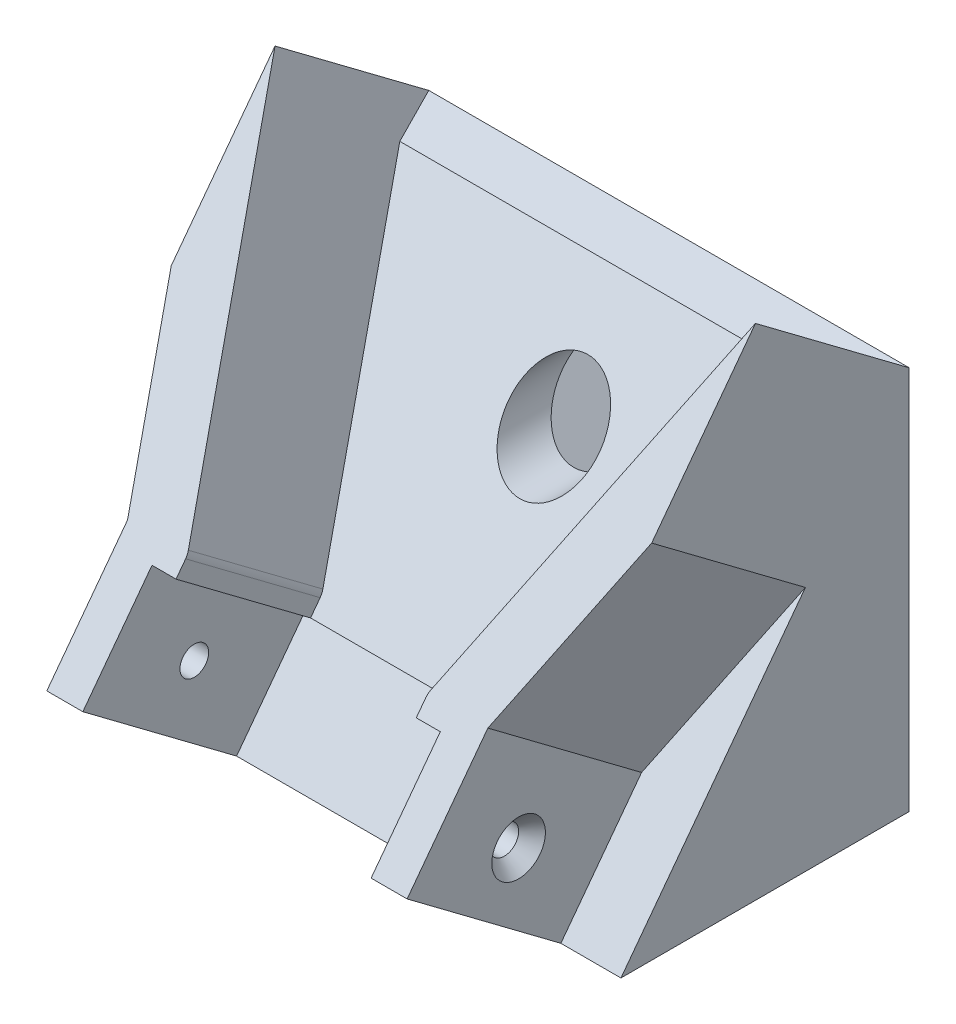
ISO-10303-21;
HEADER;
FILE_DESCRIPTION(('STEP AP214'),'2;1');
FILE_NAME('part.step','',(''),(''),'','','');
FILE_SCHEMA(('AUTOMOTIVE_DESIGN { 1 0 10303 214 1 1 1 1 }'));
ENDSEC;
DATA;
#1=APPLICATION_CONTEXT('core data for automotive mechanical design processes');
#2=APPLICATION_PROTOCOL_DEFINITION('international standard','automotive_design',2000,#1);
#3=PRODUCT_CONTEXT('',#1,'mechanical');
#4=PRODUCT('Part','Part','',(#3));
#5=PRODUCT_RELATED_PRODUCT_CATEGORY('part','',(#4));
#6=PRODUCT_DEFINITION_FORMATION('','',#4);
#7=PRODUCT_DEFINITION_CONTEXT('part definition',#1,'design');
#8=PRODUCT_DEFINITION('design','',#6,#7);
#9=PRODUCT_DEFINITION_SHAPE('','',#8);
#10=(LENGTH_UNIT() NAMED_UNIT(*) SI_UNIT(.MILLI.,.METRE.));
#11=(NAMED_UNIT(*) PLANE_ANGLE_UNIT() SI_UNIT($,.RADIAN.));
#12=(NAMED_UNIT(*) SI_UNIT($,.STERADIAN.) SOLID_ANGLE_UNIT());
#13=UNCERTAINTY_MEASURE_WITH_UNIT(LENGTH_MEASURE(1.E-05),#10,'distance_accuracy_value','');
#14=(GEOMETRIC_REPRESENTATION_CONTEXT(3) GLOBAL_UNCERTAINTY_ASSIGNED_CONTEXT((#13)) GLOBAL_UNIT_ASSIGNED_CONTEXT((#10,
#11,#12)) REPRESENTATION_CONTEXT('',''));
#15=CARTESIAN_POINT('',(0.,0.,0.));
#16=DIRECTION('',(0.,0.,1.));
#17=DIRECTION('',(1.,0.,0.));
#18=AXIS2_PLACEMENT_3D('',#15,#16,#17);
#19=CARTESIAN_POINT('',(63.5,50.8,0.));
#20=DIRECTION('',(0.,-0.600001429132666,-0.799998928148506));
#21=DIRECTION('',(0.,0.799998928148506,-0.600001429132666));
#22=AXIS2_PLACEMENT_3D('',#19,#20,#21);
#23=PLANE('',#22);
#24=DIRECTION('',(0.,-0.799998928148506,0.600001429132666));
#25=VECTOR('',#24,1.);
#26=CARTESIAN_POINT('',(50.8,0.,38.1001417970417));
#27=LINE('',#26,#25);
#28=CARTESIAN_POINT('',(50.8,12.1919836649832,28.9561200170599));
#29=VERTEX_POINT('',#28);
#30=CARTESIAN_POINT('',(50.8,0.,38.1001417970417));
#31=VERTEX_POINT('',#30);
#32=EDGE_CURVE('E404',#29,#31,#27,.T.);
#33=ORIENTED_EDGE('',*,*,#32,.F.);
#34=DIRECTION('',(1.,0.,0.));
#35=VECTOR('',#34,1.);
#36=CARTESIAN_POINT('',(15.875,12.1919836649832,28.9561200170599));
#37=LINE('',#36,#35);
#38=CARTESIAN_POINT('',(12.7,12.1919836649832,28.9561200170599));
#39=VERTEX_POINT('',#38);
#40=EDGE_CURVE('E360',#39,#29,#37,.T.);
#41=ORIENTED_EDGE('',*,*,#40,.F.);
#42=DIRECTION('',(0.,0.799998928148506,-0.600001429132666));
#43=VECTOR('',#42,1.);
#44=CARTESIAN_POINT('',(12.7,0.,38.1001417970417));
#45=LINE('',#44,#43);
#46=CARTESIAN_POINT('',(12.7,0.,38.1001417970417));
#47=VERTEX_POINT('',#46);
#48=EDGE_CURVE('E362',#47,#39,#45,.T.);
#49=ORIENTED_EDGE('',*,*,#48,.F.);
#50=DIRECTION('',(-1.,0.,0.));
#51=VECTOR('',#50,1.);
#52=CARTESIAN_POINT('',(63.5,0.,38.1001417970417));
#53=LINE('',#52,#51);
#54=EDGE_CURVE('E309',#31,#47,#53,.T.);
#55=ORIENTED_EDGE('',*,*,#54,.F.);
#56=EDGE_LOOP('',(#33,#41,#49,#55));
#57=FACE_BOUND('',#56,.T.);
#58=ADVANCED_FACE('F46',(#57),#23,.F.);
#59=CARTESIAN_POINT('',(15.875,29.4640172424502,47.752089162035));
#60=DIRECTION('',(-1.,0.,0.));
#61=DIRECTION('',(0.,0.,1.));
#62=AXIS2_PLACEMENT_3D('',#59,#60,#61);
#63=PLANE('',#62);
#64=DIRECTION('',(0.,-0.799998928148505,0.600001429132667));
#65=VECTOR('',#64,1.);
#66=CARTESIAN_POINT('',(15.875,15.7862453588135,30.2291690314906));
#67=LINE('',#66,#65);
#68=CARTESIAN_POINT('',(15.875,15.7862453588135,30.2291690314906));
#69=VERTEX_POINT('',#68);
#70=CARTESIAN_POINT('',(15.875,14.0969882024794,31.4961166139314));
#71=VERTEX_POINT('',#70);
#72=EDGE_CURVE('E268',#69,#71,#67,.T.);
#73=ORIENTED_EDGE('',*,*,#72,.F.);
#74=DIRECTION('',(0.,-0.600001429132666,-0.799998928148506));
#75=VECTOR('',#74,1.);
#76=CARTESIAN_POINT('',(15.875,29.121277121287,48.0091452095911));
#77=LINE('',#76,#75);
#78=CARTESIAN_POINT('',(15.875,29.121277121287,48.0091452095911));
#79=VERTEX_POINT('',#78);
#80=EDGE_CURVE('E304',#69,#79,#77,.F.);
#81=ORIENTED_EDGE('',*,*,#80,.T.);
#82=DIRECTION('',(0.,0.799998928148506,-0.600001429132666));
#83=VECTOR('',#82,1.);
#84=CARTESIAN_POINT('',(15.875,29.4640172424502,47.752089162035));
#85=LINE('',#84,#83);
#86=CARTESIAN_POINT('',(15.875,27.4320199649529,49.2760927920319));
#87=VERTEX_POINT('',#86);
#88=EDGE_CURVE('E375',#87,#79,#85,.T.);
#89=ORIENTED_EDGE('',*,*,#88,.F.);
#90=DIRECTION('',(0.,-0.600001429132666,-0.799998928148506));
#91=VECTOR('',#90,1.);
#92=CARTESIAN_POINT('',(15.875,27.4320199649529,49.2760927920319));
#93=LINE('',#92,#91);
#94=EDGE_CURVE('E248',#87,#71,#93,.T.);
#95=ORIENTED_EDGE('',*,*,#94,.T.);
#96=EDGE_LOOP('',(#73,#81,#89,#95));
#97=FACE_BOUND('',#96,.T.);
#98=ADVANCED_FACE('F473',(#97),#63,.F.);
#99=CARTESIAN_POINT('',(47.625,27.4320199649529,49.2760927920319));
#100=DIRECTION('',(1.,0.,0.));
#101=DIRECTION('',(0.,0.,-1.));
#102=AXIS2_PLACEMENT_3D('',#99,#100,#101);
#103=PLANE('',#102);
#104=DIRECTION('',(0.,-0.799998928148506,0.600001429132666));
#105=VECTOR('',#104,1.);
#106=CARTESIAN_POINT('',(47.625,15.7862453588135,30.2291690314905));
#107=LINE('',#106,#105);
#108=CARTESIAN_POINT('',(47.625,15.7862453588135,30.2291690314905));
#109=VERTEX_POINT('',#108);
#110=CARTESIAN_POINT('',(47.625,14.0969882024794,31.4961166139314));
#111=VERTEX_POINT('',#110);
#112=EDGE_CURVE('E63',#109,#111,#107,.T.);
#113=ORIENTED_EDGE('',*,*,#112,.T.);
#114=DIRECTION('',(0.,-0.600001429132666,-0.799998928148506));
#115=VECTOR('',#114,1.);
#116=CARTESIAN_POINT('',(47.625,27.4320199649529,49.2760927920319));
#117=LINE('',#116,#115);
#118=CARTESIAN_POINT('',(47.625,27.4320199649529,49.2760927920319));
#119=VERTEX_POINT('',#118);
#120=EDGE_CURVE('E295',#119,#111,#117,.T.);
#121=ORIENTED_EDGE('',*,*,#120,.F.);
#122=DIRECTION('',(0.,-0.799998928148505,0.600001429132667));
#123=VECTOR('',#122,1.);
#124=CARTESIAN_POINT('',(47.625,27.4320199649529,49.2760927920319));
#125=LINE('',#124,#123);
#126=CARTESIAN_POINT('',(47.625,29.121277121287,48.0091452095911));
#127=VERTEX_POINT('',#126);
#128=EDGE_CURVE('E392',#127,#119,#125,.T.);
#129=ORIENTED_EDGE('',*,*,#128,.F.);
#130=DIRECTION('',(0.,-0.600001429132666,-0.799998928148506));
#131=VECTOR('',#130,1.);
#132=CARTESIAN_POINT('',(47.625,29.121277121287,48.0091452095911));
#133=LINE('',#132,#131);
#134=EDGE_CURVE('E299',#127,#109,#133,.T.);
#135=ORIENTED_EDGE('',*,*,#134,.T.);
#136=EDGE_LOOP('',(#113,#121,#129,#135));
#137=FACE_BOUND('',#136,.T.);
#138=ADVANCED_FACE('F481',(#137),#103,.F.);
#139=CARTESIAN_POINT('',(13.335,29.121277121287,48.0091452095911));
#140=DIRECTION('',(0.,-0.600001429132666,-0.799998928148506));
#141=DIRECTION('',(0.,0.799998928148506,-0.600001429132666));
#142=AXIS2_PLACEMENT_3D('',#139,#140,#141);
#143=CYLINDRICAL_SURFACE('',#142,2.54);
#144=ORIENTED_EDGE('',*,*,#80,.F.);
#145=CARTESIAN_POINT('',(13.335,15.7862453588135,30.2291690314906));
#146=DIRECTION('',(0.,-0.600001429132666,-0.799998928148506));
#147=DIRECTION('',(0.,0.799998928148506,-0.600001429132666));
#148=AXIS2_PLACEMENT_3D('',#145,#146,#147);
#149=CIRCLE('',#148,2.54000000000002);
#150=CARTESIAN_POINT('',(15.7344715875595,16.4527631109403,29.7292788569575));
#151=VERTEX_POINT('',#150);
#152=EDGE_CURVE('E265',#151,#69,#149,.T.);
#153=ORIENTED_EDGE('',*,*,#152,.F.);
#154=DIRECTION('',(0.,-0.600001429132666,-0.799998928148506));
#155=VECTOR('',#154,1.);
#156=CARTESIAN_POINT('',(15.7344715875595,29.7877948734138,47.5092550350581));
#157=LINE('',#156,#155);
#158=CARTESIAN_POINT('',(15.7344715875595,29.7877948734138,47.5092550350581));
#159=VERTEX_POINT('',#158);
#160=EDGE_CURVE('E219',#159,#151,#157,.T.);
#161=ORIENTED_EDGE('',*,*,#160,.F.);
#162=CARTESIAN_POINT('',(13.335,29.121277121287,48.0091452095911));
#163=DIRECTION('',(0.,0.600001429132666,0.799998928148506));
#164=DIRECTION('',(0.,-0.799998928148506,0.600001429132666));
#165=AXIS2_PLACEMENT_3D('',#162,#163,#164);
#166=CIRCLE('',#165,2.54);
#167=EDGE_CURVE('E302',#79,#159,#166,.T.);
#168=ORIENTED_EDGE('',*,*,#167,.F.);
#169=EDGE_LOOP('',(#144,#153,#161,#168));
#170=FACE_BOUND('',#169,.T.);
#171=ADVANCED_FACE('F767',(#170),#143,.T.);
#172=CARTESIAN_POINT('',(50.165,29.121277121287,48.0091452095911));
#173=DIRECTION('',(0.,-0.600001429132666,-0.799998928148506));
#174=DIRECTION('',(0.,0.799998928148506,-0.600001429132666));
#175=AXIS2_PLACEMENT_3D('',#172,#173,#174);
#176=CYLINDRICAL_SURFACE('',#175,2.54);
#177=DIRECTION('',(0.,-0.600001429132666,-0.799998928148506));
#178=VECTOR('',#177,1.);
#179=CARTESIAN_POINT('',(47.7655284124406,29.7877948734138,47.509255035058));
#180=LINE('',#179,#178);
#181=CARTESIAN_POINT('',(47.7655284124406,16.4527631109403,29.7292788569575));
#182=VERTEX_POINT('',#181);
#183=CARTESIAN_POINT('',(47.7655284124406,29.7877948734138,47.509255035058));
#184=VERTEX_POINT('',#183);
#185=EDGE_CURVE('E55',#182,#184,#180,.F.);
#186=ORIENTED_EDGE('',*,*,#185,.F.);
#187=CARTESIAN_POINT('',(50.1649999999999,15.7862453588135,30.2291690314905));
#188=DIRECTION('',(0.,0.600001429132666,0.799998928148506));
#189=DIRECTION('',(0.,-0.799998928148506,0.600001429132666));
#190=AXIS2_PLACEMENT_3D('',#187,#188,#189);
#191=CIRCLE('',#190,2.5399999999999);
#192=EDGE_CURVE('E282',#182,#109,#191,.T.);
#193=ORIENTED_EDGE('',*,*,#192,.T.);
#194=ORIENTED_EDGE('',*,*,#134,.F.);
#195=CARTESIAN_POINT('',(50.165,29.121277121287,48.0091452095911));
#196=DIRECTION('',(0.,-0.600001429132666,-0.799998928148506));
#197=DIRECTION('',(0.,0.799998928148506,-0.600001429132666));
#198=AXIS2_PLACEMENT_3D('',#195,#196,#197);
#199=CIRCLE('',#198,2.54);
#200=EDGE_CURVE('E12',#184,#127,#199,.F.);
#201=ORIENTED_EDGE('',*,*,#200,.F.);
#202=EDGE_LOOP('',(#186,#193,#194,#201));
#203=FACE_BOUND('',#202,.T.);
#204=ADVANCED_FACE('F48',(#203),#176,.T.);
#205=CARTESIAN_POINT('',(55.5625,29.4640172424502,47.752089162035));
#206=DIRECTION('',(-1.,0.,0.));
#207=DIRECTION('',(0.,-1.,0.));
#208=AXIS2_PLACEMENT_3D('',#205,#206,#207);
#209=PLANE('',#208);
#210=DIRECTION('',(0.,0.799998928148506,-0.600001429132666));
#211=VECTOR('',#210,1.);
#212=CARTESIAN_POINT('',(55.5625,14.2239809424804,27.4321163870629));
#213=LINE('',#212,#211);
#214=CARTESIAN_POINT('',(55.5625,0.,38.1001417970417));
#215=VERTEX_POINT('',#214);
#216=CARTESIAN_POINT('',(55.5625,14.2239809424804,27.4321163870629));
#217=VERTEX_POINT('',#216);
#218=EDGE_CURVE('E387',#215,#217,#213,.T.);
#219=ORIENTED_EDGE('',*,*,#218,.T.);
#220=DIRECTION('',(0.,-0.600001429132666,-0.799998928148506));
#221=VECTOR('',#220,1.);
#222=CARTESIAN_POINT('',(55.5625,29.4640172424502,47.752089162035));
#223=LINE('',#222,#221);
#224=CARTESIAN_POINT('',(55.5625,29.4640172424502,47.752089162035));
#225=VERTEX_POINT('',#224);
#226=EDGE_CURVE('E402',#225,#217,#223,.T.);
#227=ORIENTED_EDGE('',*,*,#226,.F.);
#228=DIRECTION('',(0.,0.799998928148506,-0.600001429132666));
#229=VECTOR('',#228,1.);
#230=CARTESIAN_POINT('',(55.5625,29.4640172424502,47.752089162035));
#231=LINE('',#230,#229);
#232=CARTESIAN_POINT('',(55.5625,15.2400362999697,58.4201145720138));
#233=VERTEX_POINT('',#232);
#234=EDGE_CURVE('E400',#233,#225,#231,.T.);
#235=ORIENTED_EDGE('',*,*,#234,.F.);
#236=DIRECTION('',(0.,-0.600001429132666,-0.799998928148506));
#237=VECTOR('',#236,1.);
#238=CARTESIAN_POINT('',(55.5625,15.2400362999697,58.4201145720138));
#239=LINE('',#238,#237);
#240=EDGE_CURVE('E411',#233,#215,#239,.T.);
#241=ORIENTED_EDGE('',*,*,#240,.T.);
#242=EDGE_LOOP('',(#219,#227,#235,#241));
#243=FACE_BOUND('',#242,.T.);
#244=CARTESIAN_POINT('',(55.5625,13.7160099824765,43.6881172945368));
#245=DIRECTION('',(1.,0.,0.));
#246=DIRECTION('',(0.,0.,-1.));
#247=AXIS2_PLACEMENT_3D('',#244,#245,#246);
#248=CIRCLE('',#247,3.5433);
#249=CARTESIAN_POINT('',(55.5625,13.7160099824765,40.1448172945368));
#250=VERTEX_POINT('',#249);
#251=EDGE_CURVE('E439',#250,#250,#248,.T.);
#252=ORIENTED_EDGE('',*,*,#251,.F.);
#253=EDGE_LOOP('',(#252));
#254=FACE_BOUND('',#253,.T.);
#255=ADVANCED_FACE('F672',(#243,#254),#209,.F.);
#256=CARTESIAN_POINT('',(7.9375,29.4640172424502,47.752089162035));
#257=DIRECTION('',(1.,0.,0.));
#258=DIRECTION('',(0.,1.,0.));
#259=AXIS2_PLACEMENT_3D('',#256,#257,#258);
#260=PLANE('',#259);
#261=DIRECTION('',(0.,-0.799998928148506,0.600001429132666));
#262=VECTOR('',#261,1.);
#263=CARTESIAN_POINT('',(7.9375,14.2239809424804,27.4321163870629));
#264=LINE('',#263,#262);
#265=CARTESIAN_POINT('',(7.9375,14.2239809424804,27.4321163870629));
#266=VERTEX_POINT('',#265);
#267=CARTESIAN_POINT('',(7.93750000000001,0.,38.1001417970417));
#268=VERTEX_POINT('',#267);
#269=EDGE_CURVE('E353',#266,#268,#264,.T.);
#270=ORIENTED_EDGE('',*,*,#269,.T.);
#271=DIRECTION('',(0.,-0.600001429132666,-0.799998928148506));
#272=VECTOR('',#271,1.);
#273=CARTESIAN_POINT('',(7.93750000000001,15.2400362999697,58.4201145720138));
#274=LINE('',#273,#272);
#275=CARTESIAN_POINT('',(7.93750000000001,15.2400362999697,58.4201145720138));
#276=VERTEX_POINT('',#275);
#277=EDGE_CURVE('E349',#276,#268,#274,.T.);
#278=ORIENTED_EDGE('',*,*,#277,.F.);
#279=DIRECTION('',(0.,-0.799998928148506,0.600001429132666));
#280=VECTOR('',#279,1.);
#281=CARTESIAN_POINT('',(7.9375,29.4640172424502,47.752089162035));
#282=LINE('',#281,#280);
#283=CARTESIAN_POINT('',(7.9375,29.4640172424502,47.752089162035));
#284=VERTEX_POINT('',#283);
#285=EDGE_CURVE('E352',#284,#276,#282,.T.);
#286=ORIENTED_EDGE('',*,*,#285,.F.);
#287=DIRECTION('',(0.,-0.600001429132666,-0.799998928148506));
#288=VECTOR('',#287,1.);
#289=CARTESIAN_POINT('',(7.9375,29.4640172424502,47.752089162035));
#290=LINE('',#289,#288);
#291=EDGE_CURVE('E255',#284,#266,#290,.T.);
#292=ORIENTED_EDGE('',*,*,#291,.T.);
#293=EDGE_LOOP('',(#270,#278,#286,#292));
#294=FACE_BOUND('',#293,.T.);
#295=CARTESIAN_POINT('',(7.9375,13.7160099824765,43.6881172945368));
#296=DIRECTION('',(-1.,0.,0.));
#297=DIRECTION('',(0.,0.,1.));
#298=AXIS2_PLACEMENT_3D('',#295,#296,#297);
#299=CIRCLE('',#298,3.5433);
#300=CARTESIAN_POINT('',(7.9375,13.7160099824765,47.2314172945368));
#301=VERTEX_POINT('',#300);
#302=EDGE_CURVE('E430',#301,#301,#299,.T.);
#303=ORIENTED_EDGE('',*,*,#302,.F.);
#304=EDGE_LOOP('',(#303));
#305=FACE_BOUND('',#304,.T.);
#306=ADVANCED_FACE('F488',(#294,#305),#260,.F.);
#307=DIRECTION('',(0.328011144260879,0.75573807014581,-0.566805662086182));
#308=VECTOR('',#307,1.);
#309=CARTESIAN_POINT('',(63.5,32.5119904712402,13.7160581935314));
#310=LINE('',#309,#308);
#311=CARTESIAN_POINT('',(63.5,32.5119904712403,13.7160581935314));
#312=VERTEX_POINT('',#311);
#313=EDGE_CURVE('E368',#217,#312,#310,.T.);
#314=ORIENTED_EDGE('',*,*,#313,.F.);
#315=ORIENTED_EDGE('',*,*,#218,.F.);
#316=CARTESIAN_POINT('',(63.5,0.,38.1001417970417));
#317=VERTEX_POINT('',#316);
#318=EDGE_CURVE('E220',#317,#215,#53,.T.);
#319=ORIENTED_EDGE('',*,*,#318,.F.);
#320=DIRECTION('',(0.,-0.799998928148506,0.600001429132666));
#321=VECTOR('',#320,1.);
#322=CARTESIAN_POINT('',(63.5,50.8,0.));
#323=LINE('',#322,#321);
#324=EDGE_CURVE('E290',#312,#317,#323,.T.);
#325=ORIENTED_EDGE('',*,*,#324,.F.);
#326=EDGE_LOOP('',(#314,#315,#319,#325));
#327=FACE_BOUND('',#326,.T.);
#328=ADVANCED_FACE('F476',(#327),#23,.F.);
#329=ORIENTED_EDGE('',*,*,#269,.F.);
#330=DIRECTION('',(0.32801114426088,-0.75573807014581,0.566805662086182));
#331=VECTOR('',#330,1.);
#332=CARTESIAN_POINT('',(0.,32.5119904712402,13.7160581935315));
#333=LINE('',#332,#331);
#334=CARTESIAN_POINT('',(0.,32.5119904712402,13.7160581935315));
#335=VERTEX_POINT('',#334);
#336=EDGE_CURVE('E357',#335,#266,#333,.T.);
#337=ORIENTED_EDGE('',*,*,#336,.F.);
#338=DIRECTION('',(0.,-0.799998928148506,0.600001429132666));
#339=VECTOR('',#338,1.);
#340=CARTESIAN_POINT('',(0.,50.8,0.));
#341=LINE('',#340,#339);
#342=CARTESIAN_POINT('',(0.,0.,38.1001417970417));
#343=VERTEX_POINT('',#342);
#344=EDGE_CURVE('E242',#335,#343,#341,.T.);
#345=ORIENTED_EDGE('',*,*,#344,.T.);
#346=EDGE_CURVE('E310',#268,#343,#53,.T.);
#347=ORIENTED_EDGE('',*,*,#346,.F.);
#348=EDGE_LOOP('',(#329,#337,#345,#347));
#349=FACE_BOUND('',#348,.T.);
#350=ADVANCED_FACE('F477',(#349),#23,.F.);
#351=CARTESIAN_POINT('',(63.5,0.,38.1001417970417));
#352=DIRECTION('',(0.,1.,0.));
#353=DIRECTION('',(0.,0.,1.));
#354=AXIS2_PLACEMENT_3D('',#351,#352,#353);
#355=PLANE('',#354);
#356=DIRECTION('',(0.,0.,-1.));
#357=VECTOR('',#356,1.);
#358=CARTESIAN_POINT('',(0.,0.,38.1001417970417));
#359=LINE('',#358,#357);
#360=CARTESIAN_POINT('',(0.,0.,0.));
#361=VERTEX_POINT('',#360);
#362=EDGE_CURVE('E291',#343,#361,#359,.T.);
#363=ORIENTED_EDGE('',*,*,#362,.T.);
#364=DIRECTION('',(-1.,0.,0.));
#365=VECTOR('',#364,1.);
#366=CARTESIAN_POINT('',(63.5,0.,0.));
#367=LINE('',#366,#365);
#368=CARTESIAN_POINT('',(63.5,0.,0.));
#369=VERTEX_POINT('',#368);
#370=EDGE_CURVE('E239',#369,#361,#367,.T.);
#371=ORIENTED_EDGE('',*,*,#370,.F.);
#372=DIRECTION('',(0.,0.,-1.));
#373=VECTOR('',#372,1.);
#374=CARTESIAN_POINT('',(63.5,0.,38.1001417970417));
#375=LINE('',#374,#373);
#376=EDGE_CURVE('E312',#317,#369,#375,.T.);
#377=ORIENTED_EDGE('',*,*,#376,.F.);
#378=ORIENTED_EDGE('',*,*,#318,.T.);
#379=DIRECTION('',(1.,0.,0.));
#380=VECTOR('',#379,1.);
#381=CARTESIAN_POINT('',(55.5625,0.,38.1001417970417));
#382=LINE('',#381,#380);
#383=EDGE_CURVE('E406',#31,#215,#382,.T.);
#384=ORIENTED_EDGE('',*,*,#383,.F.);
#385=ORIENTED_EDGE('',*,*,#54,.T.);
#386=DIRECTION('',(1.,0.,0.));
#387=VECTOR('',#386,1.);
#388=CARTESIAN_POINT('',(7.93750000000001,0.,38.1001417970417));
#389=LINE('',#388,#387);
#390=EDGE_CURVE('E365',#268,#47,#389,.T.);
#391=ORIENTED_EDGE('',*,*,#390,.F.);
#392=ORIENTED_EDGE('',*,*,#346,.T.);
#393=EDGE_LOOP('',(#363,#371,#377,#378,#384,#385,#391,#392));
#394=FACE_BOUND('',#393,.T.);
#395=DIRECTION('',(0.,0.,-1.));
#396=VECTOR('',#395,1.);
#397=CARTESIAN_POINT('',(2.54,0.,0.));
#398=LINE('',#397,#396);
#399=CARTESIAN_POINT('',(2.54,0.,34.9251375431254));
#400=VERTEX_POINT('',#399);
#401=CARTESIAN_POINT('',(2.54,0.,2.54));
#402=VERTEX_POINT('',#401);
#403=EDGE_CURVE('E318',#400,#402,#398,.T.);
#404=ORIENTED_EDGE('',*,*,#403,.F.);
#405=DIRECTION('',(-1.,0.,0.));
#406=VECTOR('',#405,1.);
#407=CARTESIAN_POINT('',(63.5,0.,34.9251375431254));
#408=LINE('',#407,#406);
#409=CARTESIAN_POINT('',(60.96,0.,34.9251375431254));
#410=VERTEX_POINT('',#409);
#411=EDGE_CURVE('E322',#410,#400,#408,.T.);
#412=ORIENTED_EDGE('',*,*,#411,.F.);
#413=DIRECTION('',(0.,0.,-1.));
#414=VECTOR('',#413,1.);
#415=CARTESIAN_POINT('',(60.96,0.,0.));
#416=LINE('',#415,#414);
#417=CARTESIAN_POINT('',(60.96,0.,2.54));
#418=VERTEX_POINT('',#417);
#419=EDGE_CURVE('E326',#410,#418,#416,.T.);
#420=ORIENTED_EDGE('',*,*,#419,.T.);
#421=DIRECTION('',(-1.,0.,0.));
#422=VECTOR('',#421,1.);
#423=CARTESIAN_POINT('',(63.5,0.,2.54));
#424=LINE('',#423,#422);
#425=EDGE_CURVE('E325',#418,#402,#424,.T.);
#426=ORIENTED_EDGE('',*,*,#425,.T.);
#427=EDGE_LOOP('',(#404,#412,#420,#426));
#428=FACE_BOUND('',#427,.T.);
#429=ADVANCED_FACE('F491',(#394,#428),#355,.F.);
#430=CARTESIAN_POINT('',(63.5,0.,0.));
#431=DIRECTION('',(0.,0.,1.));
#432=DIRECTION('',(1.,0.,0.));
#433=AXIS2_PLACEMENT_3D('',#430,#431,#432);
#434=PLANE('',#433);
#435=CARTESIAN_POINT('',(31.75,35.8,0.));
#436=DIRECTION('',(0.,0.,-1.));
#437=DIRECTION('',(-1.,0.,0.));
#438=AXIS2_PLACEMENT_3D('',#435,#436,#437);
#439=CIRCLE('',#438,3.5);
#440=CARTESIAN_POINT('',(28.25,35.8,0.));
#441=VERTEX_POINT('',#440);
#442=EDGE_CURVE('E442',#441,#441,#439,.T.);
#443=ORIENTED_EDGE('',*,*,#442,.F.);
#444=EDGE_LOOP('',(#443));
#445=FACE_BOUND('',#444,.T.);
#446=DIRECTION('',(0.,1.,0.));
#447=VECTOR('',#446,1.);
#448=CARTESIAN_POINT('',(0.,0.,0.));
#449=LINE('',#448,#447);
#450=CARTESIAN_POINT('',(0.,50.8,0.));
#451=VERTEX_POINT('',#450);
#452=EDGE_CURVE('E236',#361,#451,#449,.T.);
#453=ORIENTED_EDGE('',*,*,#452,.T.);
#454=DIRECTION('',(-1.,0.,0.));
#455=VECTOR('',#454,1.);
#456=CARTESIAN_POINT('',(63.5,50.8,0.));
#457=LINE('',#456,#455);
#458=CARTESIAN_POINT('',(63.5,50.8,0.));
#459=VERTEX_POINT('',#458);
#460=EDGE_CURVE('E208',#459,#451,#457,.T.);
#461=ORIENTED_EDGE('',*,*,#460,.F.);
#462=DIRECTION('',(0.,1.,0.));
#463=VECTOR('',#462,1.);
#464=CARTESIAN_POINT('',(63.5,0.,0.));
#465=LINE('',#464,#463);
#466=EDGE_CURVE('E287',#369,#459,#465,.T.);
#467=ORIENTED_EDGE('',*,*,#466,.F.);
#468=ORIENTED_EDGE('',*,*,#370,.T.);
#469=EDGE_LOOP('',(#453,#461,#467,#468));
#470=FACE_BOUND('',#469,.T.);
#471=ADVANCED_FACE('F237',(#445,#470),#434,.F.);
#472=CARTESIAN_POINT('',(63.5,0.,0.));
#473=DIRECTION('',(-1.,0.,0.));
#474=DIRECTION('',(0.,0.,1.));
#475=AXIS2_PLACEMENT_3D('',#472,#473,#474);
#476=PLANE('',#475);
#477=ORIENTED_EDGE('',*,*,#466,.T.);
#478=DIRECTION('',(0.,-0.600001429132666,-0.799998928148506));
#479=VECTOR('',#478,1.);
#480=CARTESIAN_POINT('',(63.5,66.0400362999697,20.319972774972));
#481=LINE('',#480,#479);
#482=CARTESIAN_POINT('',(63.5,66.0400362999697,20.319972774972));
#483=VERTEX_POINT('',#482);
#484=EDGE_CURVE('E294',#483,#459,#481,.T.);
#485=ORIENTED_EDGE('',*,*,#484,.F.);
#486=DIRECTION('',(0.,0.799998928148506,-0.600001429132666));
#487=VECTOR('',#486,1.);
#488=CARTESIAN_POINT('',(63.5,66.0400362999697,20.319972774972));
#489=LINE('',#488,#487);
#490=CARTESIAN_POINT('',(63.5,47.75202677121,34.0360309685035));
#491=VERTEX_POINT('',#490);
#492=EDGE_CURVE('E388',#491,#483,#489,.T.);
#493=ORIENTED_EDGE('',*,*,#492,.F.);
#494=DIRECTION('',(0.,-0.600001429132666,-0.799998928148506));
#495=VECTOR('',#494,1.);
#496=CARTESIAN_POINT('',(63.5,47.75202677121,34.0360309685035));
#497=LINE('',#496,#495);
#498=EDGE_CURVE('E296',#491,#312,#497,.T.);
#499=ORIENTED_EDGE('',*,*,#498,.T.);
#500=ORIENTED_EDGE('',*,*,#324,.T.);
#501=ORIENTED_EDGE('',*,*,#376,.T.);
#502=EDGE_LOOP('',(#477,#485,#493,#499,#500,#501));
#503=FACE_BOUND('',#502,.T.);
#504=ADVANCED_FACE('F546',(#503),#476,.F.);
#505=CARTESIAN_POINT('',(0.,0.,0.));
#506=DIRECTION('',(-1.,0.,0.));
#507=DIRECTION('',(0.,0.,1.));
#508=AXIS2_PLACEMENT_3D('',#505,#506,#507);
#509=PLANE('',#508);
#510=ORIENTED_EDGE('',*,*,#452,.F.);
#511=ORIENTED_EDGE('',*,*,#362,.F.);
#512=ORIENTED_EDGE('',*,*,#344,.F.);
#513=DIRECTION('',(0.,-0.600001429132666,-0.799998928148506));
#514=VECTOR('',#513,1.);
#515=CARTESIAN_POINT('',(0.,47.7520267712099,34.0360309685035));
#516=LINE('',#515,#514);
#517=CARTESIAN_POINT('',(0.,47.7520267712099,34.0360309685035));
#518=VERTEX_POINT('',#517);
#519=EDGE_CURVE('E249',#518,#335,#516,.T.);
#520=ORIENTED_EDGE('',*,*,#519,.F.);
#521=DIRECTION('',(0.,-0.799998928148506,0.600001429132666));
#522=VECTOR('',#521,1.);
#523=CARTESIAN_POINT('',(0.,66.0400362999697,20.319972774972));
#524=LINE('',#523,#522);
#525=CARTESIAN_POINT('',(0.,66.0400362999697,20.319972774972));
#526=VERTEX_POINT('',#525);
#527=EDGE_CURVE('E247',#526,#518,#524,.T.);
#528=ORIENTED_EDGE('',*,*,#527,.F.);
#529=DIRECTION('',(0.,-0.600001429132666,-0.799998928148506));
#530=VECTOR('',#529,1.);
#531=CARTESIAN_POINT('',(0.,66.0400362999697,20.319972774972));
#532=LINE('',#531,#530);
#533=EDGE_CURVE('E228',#526,#451,#532,.T.);
#534=ORIENTED_EDGE('',*,*,#533,.T.);
#535=EDGE_LOOP('',(#510,#511,#512,#520,#528,#534));
#536=FACE_BOUND('',#535,.T.);
#537=ADVANCED_FACE('F245',(#536),#509,.T.);
#538=CARTESIAN_POINT('',(63.5,0.,2.54));
#539=DIRECTION('',(0.,0.,1.));
#540=DIRECTION('',(1.,0.,0.));
#541=AXIS2_PLACEMENT_3D('',#538,#539,#540);
#542=PLANE('',#541);
#543=DIRECTION('',(0.,1.,0.));
#544=VECTOR('',#543,1.);
#545=CARTESIAN_POINT('',(2.54,0.,2.54));
#546=LINE('',#545,#544);
#547=CARTESIAN_POINT('',(2.54,43.1800226874355,2.54));
#548=VERTEX_POINT('',#547);
#549=EDGE_CURVE('E335',#402,#548,#546,.T.);
#550=ORIENTED_EDGE('',*,*,#549,.F.);
#551=ORIENTED_EDGE('',*,*,#425,.F.);
#552=DIRECTION('',(0.,1.,0.));
#553=VECTOR('',#552,1.);
#554=CARTESIAN_POINT('',(60.96,0.,2.54));
#555=LINE('',#554,#553);
#556=CARTESIAN_POINT('',(60.96,43.1800226874355,2.54));
#557=VERTEX_POINT('',#556);
#558=EDGE_CURVE('E320',#418,#557,#555,.T.);
#559=ORIENTED_EDGE('',*,*,#558,.T.);
#560=DIRECTION('',(-1.,0.,0.));
#561=VECTOR('',#560,1.);
#562=CARTESIAN_POINT('',(63.5,43.1800226874355,2.54));
#563=LINE('',#562,#561);
#564=EDGE_CURVE('E243',#557,#548,#563,.T.);
#565=ORIENTED_EDGE('',*,*,#564,.T.);
#566=EDGE_LOOP('',(#550,#551,#559,#565));
#567=FACE_BOUND('',#566,.T.);
#568=CARTESIAN_POINT('',(31.75,35.8,2.54));
#569=DIRECTION('',(0.,0.,1.));
#570=DIRECTION('',(1.,0.,0.));
#571=AXIS2_PLACEMENT_3D('',#568,#569,#570);
#572=CIRCLE('',#571,3.5);
#573=CARTESIAN_POINT('',(35.25,35.8,2.54));
#574=VERTEX_POINT('',#573);
#575=EDGE_CURVE('E277',#574,#574,#572,.F.);
#576=ORIENTED_EDGE('',*,*,#575,.T.);
#577=EDGE_LOOP('',(#576));
#578=FACE_BOUND('',#577,.T.);
#579=ADVANCED_FACE('F536',(#567,#578),#542,.T.);
#580=CARTESIAN_POINT('',(63.5,49.275996370003,-2.0319972774972));
#581=DIRECTION('',(0.,-0.600001429132666,-0.799998928148506));
#582=DIRECTION('',(0.,0.799998928148506,-0.600001429132666));
#583=AXIS2_PLACEMENT_3D('',#580,#581,#582);
#584=PLANE('',#583);
#585=CARTESIAN_POINT('',(31.75,35.8,8.0750376152889));
#586=DIRECTION('',(0.,-0.600001429132666,-0.799998928148506));
#587=DIRECTION('',(0.,0.799998928148506,-0.600001429132666));
#588=AXIS2_PLACEMENT_3D('',#585,#586,#587);
#589=ELLIPSE('',#588,7.50001004862123,6.);
#590=CARTESIAN_POINT('',(31.75,41.8,3.57502086760681));
#591=VERTEX_POINT('',#590);
#592=EDGE_CURVE('E232',#591,#591,#589,.F.);
#593=ORIENTED_EDGE('',*,*,#592,.T.);
#594=EDGE_LOOP('',(#593));
#595=FACE_BOUND('',#594,.T.);
#596=DIRECTION('',(0.,-0.799998928148506,0.600001429132666));
#597=VECTOR('',#596,1.);
#598=CARTESIAN_POINT('',(2.54,16.7640834900341,22.352028132343));
#599=LINE('',#598,#597);
#600=EDGE_CURVE('E321',#548,#400,#599,.T.);
#601=ORIENTED_EDGE('',*,*,#600,.F.);
#602=ORIENTED_EDGE('',*,*,#564,.F.);
#603=DIRECTION('',(0.,-0.799998928148506,0.600001429132666));
#604=VECTOR('',#603,1.);
#605=CARTESIAN_POINT('',(60.96,16.7640834900341,22.352028132343));
#606=LINE('',#605,#604);
#607=EDGE_CURVE('E329',#557,#410,#606,.T.);
#608=ORIENTED_EDGE('',*,*,#607,.T.);
#609=ORIENTED_EDGE('',*,*,#411,.T.);
#610=EDGE_LOOP('',(#601,#602,#608,#609));
#611=FACE_BOUND('',#610,.T.);
#612=ADVANCED_FACE('F539',(#595,#611),#584,.T.);
#613=CARTESIAN_POINT('',(60.96,0.,0.));
#614=DIRECTION('',(-1.,0.,0.));
#615=DIRECTION('',(0.,0.,1.));
#616=AXIS2_PLACEMENT_3D('',#613,#614,#615);
#617=PLANE('',#616);
#618=ORIENTED_EDGE('',*,*,#558,.F.);
#619=ORIENTED_EDGE('',*,*,#419,.F.);
#620=ORIENTED_EDGE('',*,*,#607,.F.);
#621=EDGE_LOOP('',(#618,#619,#620));
#622=FACE_BOUND('',#621,.T.);
#623=ADVANCED_FACE('F531',(#622),#617,.T.);
#624=CARTESIAN_POINT('',(2.54,0.,0.));
#625=DIRECTION('',(-1.,0.,0.));
#626=DIRECTION('',(0.,0.,1.));
#627=AXIS2_PLACEMENT_3D('',#624,#625,#626);
#628=PLANE('',#627);
#629=ORIENTED_EDGE('',*,*,#549,.T.);
#630=ORIENTED_EDGE('',*,*,#600,.T.);
#631=ORIENTED_EDGE('',*,*,#403,.T.);
#632=EDGE_LOOP('',(#629,#630,#631));
#633=FACE_BOUND('',#632,.T.);
#634=ADVANCED_FACE('F522',(#633),#628,.F.);
#635=CARTESIAN_POINT('',(7.93750000000001,15.2400362999697,58.4201145720138));
#636=DIRECTION('',(0.,0.799998928148506,-0.600001429132666));
#637=DIRECTION('',(0.,0.600001429132666,0.799998928148506));
#638=AXIS2_PLACEMENT_3D('',#635,#636,#637);
#639=PLANE('',#638);
#640=ORIENTED_EDGE('',*,*,#390,.T.);
#641=DIRECTION('',(0.,-0.600001429132666,-0.799998928148506));
#642=VECTOR('',#641,1.);
#643=CARTESIAN_POINT('',(12.7,15.2400362999697,58.4201145720138));
#644=LINE('',#643,#642);
#645=CARTESIAN_POINT('',(12.7,15.2400362999697,58.4201145720138));
#646=VERTEX_POINT('',#645);
#647=EDGE_CURVE('E342',#646,#47,#644,.T.);
#648=ORIENTED_EDGE('',*,*,#647,.F.);
#649=DIRECTION('',(1.,0.,0.));
#650=VECTOR('',#649,1.);
#651=CARTESIAN_POINT('',(7.93750000000001,15.2400362999697,58.4201145720138));
#652=LINE('',#651,#650);
#653=EDGE_CURVE('E356',#276,#646,#652,.T.);
#654=ORIENTED_EDGE('',*,*,#653,.F.);
#655=ORIENTED_EDGE('',*,*,#277,.T.);
#656=EDGE_LOOP('',(#640,#648,#654,#655));
#657=FACE_BOUND('',#656,.T.);
#658=ADVANCED_FACE('F520',(#657),#639,.F.);
#659=CARTESIAN_POINT('',(12.7,15.2400362999697,58.4201145720138));
#660=DIRECTION('',(-1.,0.,0.));
#661=DIRECTION('',(0.,0.,1.));
#662=AXIS2_PLACEMENT_3D('',#659,#660,#661);
#663=PLANE('',#662);
#664=CARTESIAN_POINT('',(12.7,13.7160099824765,43.6881172945368));
#665=DIRECTION('',(-1.,0.,0.));
#666=DIRECTION('',(0.,0.,1.));
#667=AXIS2_PLACEMENT_3D('',#664,#665,#666);
#668=CIRCLE('',#667,1.89865);
#669=CARTESIAN_POINT('',(12.7,13.7160099824765,45.5867672945368));
#670=VERTEX_POINT('',#669);
#671=EDGE_CURVE('E424',#670,#670,#668,.T.);
#672=ORIENTED_EDGE('',*,*,#671,.T.);
#673=EDGE_LOOP('',(#672));
#674=FACE_BOUND('',#673,.T.);
#675=ORIENTED_EDGE('',*,*,#48,.T.);
#676=DIRECTION('',(0.,-0.600001429132666,-0.799998928148506));
#677=VECTOR('',#676,1.);
#678=CARTESIAN_POINT('',(12.7,27.4320199649529,49.2760927920319));
#679=LINE('',#678,#677);
#680=CARTESIAN_POINT('',(12.7,27.4320199649529,49.2760927920319));
#681=VERTEX_POINT('',#680);
#682=EDGE_CURVE('E252',#681,#39,#679,.T.);
#683=ORIENTED_EDGE('',*,*,#682,.F.);
#684=DIRECTION('',(0.,0.799998928148506,-0.600001429132666));
#685=VECTOR('',#684,1.);
#686=CARTESIAN_POINT('',(12.7,15.2400362999697,58.4201145720138));
#687=LINE('',#686,#685);
#688=EDGE_CURVE('E380',#646,#681,#687,.T.);
#689=ORIENTED_EDGE('',*,*,#688,.F.);
#690=ORIENTED_EDGE('',*,*,#647,.T.);
#691=EDGE_LOOP('',(#675,#683,#689,#690));
#692=FACE_BOUND('',#691,.T.);
#693=ADVANCED_FACE('F518',(#674,#692),#663,.F.);
#694=CARTESIAN_POINT('',(15.875,27.4320199649529,49.2760927920319));
#695=DIRECTION('',(0.,0.799998928148506,-0.600001429132666));
#696=DIRECTION('',(0.,0.600001429132666,0.799998928148506));
#697=AXIS2_PLACEMENT_3D('',#694,#695,#696);
#698=PLANE('',#697);
#699=ORIENTED_EDGE('',*,*,#40,.T.);
#700=DIRECTION('',(0.,-0.600001429132666,-0.799998928148506));
#701=VECTOR('',#700,1.);
#702=CARTESIAN_POINT('',(50.8,27.4320199649529,49.2760927920319));
#703=LINE('',#702,#701);
#704=CARTESIAN_POINT('',(50.8,27.4320199649529,49.2760927920319));
#705=VERTEX_POINT('',#704);
#706=EDGE_CURVE('E417',#705,#29,#703,.T.);
#707=ORIENTED_EDGE('',*,*,#706,.F.);
#708=DIRECTION('',(1.,0.,0.));
#709=VECTOR('',#708,1.);
#710=CARTESIAN_POINT('',(50.8,27.4320199649529,49.2760927920319));
#711=LINE('',#710,#709);
#712=EDGE_CURVE('E394',#119,#705,#711,.T.);
#713=ORIENTED_EDGE('',*,*,#712,.F.);
#714=ORIENTED_EDGE('',*,*,#120,.T.);
#715=DIRECTION('',(1.,0.,0.));
#716=VECTOR('',#715,1.);
#717=CARTESIAN_POINT('',(15.875,14.0969882024794,31.4961166139314));
#718=LINE('',#717,#716);
#719=EDGE_CURVE('E449',#71,#111,#718,.T.);
#720=ORIENTED_EDGE('',*,*,#719,.F.);
#721=ORIENTED_EDGE('',*,*,#94,.F.);
#722=DIRECTION('',(1.,0.,0.));
#723=VECTOR('',#722,1.);
#724=CARTESIAN_POINT('',(15.875,27.4320199649529,49.2760927920319));
#725=LINE('',#724,#723);
#726=EDGE_CURVE('E378',#681,#87,#725,.T.);
#727=ORIENTED_EDGE('',*,*,#726,.F.);
#728=ORIENTED_EDGE('',*,*,#682,.T.);
#729=EDGE_LOOP('',(#699,#707,#713,#714,#720,#721,#727,#728));
#730=FACE_BOUND('',#729,.T.);
#731=ADVANCED_FACE('F528',(#730),#698,.F.);
#732=CARTESIAN_POINT('',(15.875,29.4640172424502,47.752089162035));
#733=DIRECTION('',(-0.944673853369865,-0.262408563829469,0.196807155327969));
#734=DIRECTION('',(0.267643068511453,-0.96351813053921,0.));
#735=AXIS2_PLACEMENT_3D('',#732,#733,#734);
#736=PLANE('',#735);
#737=DIRECTION('',(0.328011144260879,-0.755738070145811,0.566805662086182));
#738=VECTOR('',#737,1.);
#739=CARTESIAN_POINT('',(1.7638856065522,48.6410099825018,5.58800385686545));
#740=LINE('',#739,#738);
#741=CARTESIAN_POINT('',(1.76388560655216,48.6410099825018,5.58800385686546));
#742=VERTEX_POINT('',#741);
#743=EDGE_CURVE('E231',#742,#151,#740,.T.);
#744=ORIENTED_EDGE('',*,*,#743,.F.);
#745=DIRECTION('',(0.282453838683044,-0.345722543375551,0.894816043673309));
#746=VECTOR('',#745,1.);
#747=CARTESIAN_POINT('',(0.,50.8,0.));
#748=LINE('',#747,#746);
#749=EDGE_CURVE('E211',#451,#742,#748,.T.);
#750=ORIENTED_EDGE('',*,*,#749,.F.);
#751=ORIENTED_EDGE('',*,*,#533,.F.);
#752=DIRECTION('',(-0.32801114426088,0.75573807014581,-0.566805662086182));
#753=VECTOR('',#752,1.);
#754=CARTESIAN_POINT('',(15.875,29.4640172424502,47.752089162035));
#755=LINE('',#754,#753);
#756=EDGE_CURVE('E373',#159,#526,#755,.T.);
#757=ORIENTED_EDGE('',*,*,#756,.F.);
#758=ORIENTED_EDGE('',*,*,#160,.T.);
#759=EDGE_LOOP('',(#744,#750,#751,#757,#758));
#760=FACE_BOUND('',#759,.T.);
#761=ADVANCED_FACE('F225',(#760),#736,.F.);
#762=CARTESIAN_POINT('',(0.,47.7520267712099,34.0360309685035));
#763=DIRECTION('',(0.944673853369865,0.262408563829469,-0.196807155327969));
#764=DIRECTION('',(-0.267643068511453,0.96351813053921,0.));
#765=AXIS2_PLACEMENT_3D('',#762,#763,#764);
#766=PLANE('',#765);
#767=ORIENTED_EDGE('',*,*,#336,.T.);
#768=ORIENTED_EDGE('',*,*,#291,.F.);
#769=DIRECTION('',(0.32801114426088,-0.75573807014581,0.566805662086182));
#770=VECTOR('',#769,1.);
#771=CARTESIAN_POINT('',(0.,47.7520267712099,34.0360309685035));
#772=LINE('',#771,#770);
#773=EDGE_CURVE('E370',#518,#284,#772,.T.);
#774=ORIENTED_EDGE('',*,*,#773,.F.);
#775=ORIENTED_EDGE('',*,*,#519,.T.);
#776=EDGE_LOOP('',(#767,#768,#774,#775));
#777=FACE_BOUND('',#776,.T.);
#778=ADVANCED_FACE('F503',(#777),#766,.F.);
#779=CARTESIAN_POINT('',(0.,33.5281234200008,44.7039981848122));
#780=DIRECTION('',(0.,0.600001429132666,0.799998928148506));
#781=DIRECTION('',(0.,-0.799998928148506,0.600001429132666));
#782=AXIS2_PLACEMENT_3D('',#779,#780,#781);
#783=PLANE('',#782);
#784=ORIENTED_EDGE('',*,*,#88,.T.);
#785=ORIENTED_EDGE('',*,*,#167,.T.);
#786=ORIENTED_EDGE('',*,*,#756,.T.);
#787=ORIENTED_EDGE('',*,*,#527,.T.);
#788=ORIENTED_EDGE('',*,*,#773,.T.);
#789=ORIENTED_EDGE('',*,*,#285,.T.);
#790=ORIENTED_EDGE('',*,*,#653,.T.);
#791=ORIENTED_EDGE('',*,*,#688,.T.);
#792=ORIENTED_EDGE('',*,*,#726,.T.);
#793=EDGE_LOOP('',(#784,#785,#786,#787,#788,#789,#790,#791,#792));
#794=FACE_BOUND('',#793,.T.);
#795=ADVANCED_FACE('F509',(#794),#783,.T.);
#796=CARTESIAN_POINT('',(63.5,47.75202677121,34.0360309685035));
#797=DIRECTION('',(-0.944673853369865,0.262408563829468,-0.196807155327969));
#798=DIRECTION('',(-0.267643068511452,-0.96351813053921,0.));
#799=AXIS2_PLACEMENT_3D('',#796,#797,#798);
#800=PLANE('',#799);
#801=ORIENTED_EDGE('',*,*,#313,.T.);
#802=ORIENTED_EDGE('',*,*,#498,.F.);
#803=DIRECTION('',(0.328011144260879,0.75573807014581,-0.566805662086182));
#804=VECTOR('',#803,1.);
#805=CARTESIAN_POINT('',(63.5,47.75202677121,34.0360309685035));
#806=LINE('',#805,#804);
#807=EDGE_CURVE('E384',#225,#491,#806,.T.);
#808=ORIENTED_EDGE('',*,*,#807,.F.);
#809=ORIENTED_EDGE('',*,*,#226,.T.);
#810=EDGE_LOOP('',(#801,#802,#808,#809));
#811=FACE_BOUND('',#810,.T.);
#812=ADVANCED_FACE('F620',(#811),#800,.F.);
#813=CARTESIAN_POINT('',(47.625,29.4640172424502,47.7520891620349));
#814=DIRECTION('',(0.944673853369865,-0.262408563829469,0.196807155327969));
#815=DIRECTION('',(0.267643068511453,0.96351813053921,0.));
#816=AXIS2_PLACEMENT_3D('',#813,#814,#815);
#817=PLANE('',#816);
#818=ORIENTED_EDGE('',*,*,#484,.T.);
#819=DIRECTION('',(0.282453838683042,0.345722543375538,-0.894816043673314));
#820=VECTOR('',#819,1.);
#821=CARTESIAN_POINT('',(61.7361143934479,48.6410099825019,5.58800385686536));
#822=LINE('',#821,#820);
#823=CARTESIAN_POINT('',(61.7361143934484,48.6410099825018,5.58800385686545));
#824=VERTEX_POINT('',#823);
#825=EDGE_CURVE('E214',#824,#459,#822,.T.);
#826=ORIENTED_EDGE('',*,*,#825,.F.);
#827=DIRECTION('',(-0.328011144260891,-0.755738070145807,0.566805662086179));
#828=VECTOR('',#827,1.);
#829=CARTESIAN_POINT('',(61.7361143934484,48.6410099825018,5.58800385686545));
#830=LINE('',#829,#828);
#831=EDGE_CURVE('E278',#824,#182,#830,.T.);
#832=ORIENTED_EDGE('',*,*,#831,.T.);
#833=ORIENTED_EDGE('',*,*,#185,.T.);
#834=DIRECTION('',(-0.32801114426088,-0.75573807014581,0.566805662086182));
#835=VECTOR('',#834,1.);
#836=CARTESIAN_POINT('',(47.625,29.4640172424502,47.7520891620349));
#837=LINE('',#836,#835);
#838=EDGE_CURVE('E390',#483,#184,#837,.T.);
#839=ORIENTED_EDGE('',*,*,#838,.F.);
#840=EDGE_LOOP('',(#818,#826,#832,#833,#839));
#841=FACE_BOUND('',#840,.T.);
#842=ADVANCED_FACE('F625',(#841),#817,.F.);
#843=CARTESIAN_POINT('',(50.8,15.2400362999697,58.4201145720138));
#844=DIRECTION('',(1.,0.,0.));
#845=DIRECTION('',(0.,1.,0.));
#846=AXIS2_PLACEMENT_3D('',#843,#844,#845);
#847=PLANE('',#846);
#848=CARTESIAN_POINT('',(50.8,13.7160099824765,43.6881172945368));
#849=DIRECTION('',(1.,0.,0.));
#850=DIRECTION('',(0.,1.,0.));
#851=AXIS2_PLACEMENT_3D('',#848,#849,#850);
#852=CIRCLE('',#851,1.89865);
#853=CARTESIAN_POINT('',(50.8,15.6146599824765,43.6881172945368));
#854=VERTEX_POINT('',#853);
#855=EDGE_CURVE('E433',#854,#854,#852,.T.);
#856=ORIENTED_EDGE('',*,*,#855,.T.);
#857=EDGE_LOOP('',(#856));
#858=FACE_BOUND('',#857,.T.);
#859=ORIENTED_EDGE('',*,*,#32,.T.);
#860=DIRECTION('',(0.,-0.600001429132666,-0.799998928148506));
#861=VECTOR('',#860,1.);
#862=CARTESIAN_POINT('',(50.8,15.2400362999697,58.4201145720138));
#863=LINE('',#862,#861);
#864=CARTESIAN_POINT('',(50.8,15.2400362999697,58.4201145720138));
#865=VERTEX_POINT('',#864);
#866=EDGE_CURVE('E414',#865,#31,#863,.T.);
#867=ORIENTED_EDGE('',*,*,#866,.F.);
#868=DIRECTION('',(0.,-0.799998928148506,0.600001429132666));
#869=VECTOR('',#868,1.);
#870=CARTESIAN_POINT('',(50.8,15.2400362999697,58.4201145720138));
#871=LINE('',#870,#869);
#872=EDGE_CURVE('E396',#705,#865,#871,.T.);
#873=ORIENTED_EDGE('',*,*,#872,.F.);
#874=ORIENTED_EDGE('',*,*,#706,.T.);
#875=EDGE_LOOP('',(#859,#867,#873,#874));
#876=FACE_BOUND('',#875,.T.);
#877=ADVANCED_FACE('F640',(#858,#876),#847,.F.);
#878=CARTESIAN_POINT('',(55.5625,15.2400362999697,58.4201145720138));
#879=DIRECTION('',(0.,0.799998928148506,-0.600001429132666));
#880=DIRECTION('',(0.,0.600001429132666,0.799998928148506));
#881=AXIS2_PLACEMENT_3D('',#878,#879,#880);
#882=PLANE('',#881);
#883=ORIENTED_EDGE('',*,*,#383,.T.);
#884=ORIENTED_EDGE('',*,*,#240,.F.);
#885=DIRECTION('',(1.,0.,0.));
#886=VECTOR('',#885,1.);
#887=CARTESIAN_POINT('',(55.5625,15.2400362999697,58.4201145720138));
#888=LINE('',#887,#886);
#889=EDGE_CURVE('E398',#865,#233,#888,.T.);
#890=ORIENTED_EDGE('',*,*,#889,.F.);
#891=ORIENTED_EDGE('',*,*,#866,.T.);
#892=EDGE_LOOP('',(#883,#884,#890,#891));
#893=FACE_BOUND('',#892,.T.);
#894=ADVANCED_FACE('F634',(#893),#882,.F.);
#895=CARTESIAN_POINT('',(0.,33.5281234200008,44.7039981848122));
#896=DIRECTION('',(0.,-0.600001429132666,-0.799998928148506));
#897=DIRECTION('',(0.,0.799998928148506,-0.600001429132666));
#898=AXIS2_PLACEMENT_3D('',#895,#896,#897);
#899=PLANE('',#898);
#900=ORIENTED_EDGE('',*,*,#838,.T.);
#901=ORIENTED_EDGE('',*,*,#200,.T.);
#902=ORIENTED_EDGE('',*,*,#128,.T.);
#903=ORIENTED_EDGE('',*,*,#712,.T.);
#904=ORIENTED_EDGE('',*,*,#872,.T.);
#905=ORIENTED_EDGE('',*,*,#889,.T.);
#906=ORIENTED_EDGE('',*,*,#234,.T.);
#907=ORIENTED_EDGE('',*,*,#807,.T.);
#908=ORIENTED_EDGE('',*,*,#492,.T.);
#909=EDGE_LOOP('',(#900,#901,#902,#903,#904,#905,#906,#907,#908));
#910=FACE_BOUND('',#909,.T.);
#911=ADVANCED_FACE('F639',(#910),#899,.F.);
#912=CARTESIAN_POINT('',(7.9375,13.7160099824765,43.6881172945368));
#913=DIRECTION('',(-1.,0.,0.));
#914=DIRECTION('',(0.,0.,1.));
#915=AXIS2_PLACEMENT_3D('',#912,#913,#914);
#916=CYLINDRICAL_SURFACE('',#915,1.89865);
#917=ORIENTED_EDGE('',*,*,#671,.F.);
#918=EDGE_LOOP('',(#917));
#919=FACE_BOUND('',#918,.T.);
#920=CARTESIAN_POINT('',(9.82945340093604,13.7160099824765,43.6881172945368));
#921=DIRECTION('',(-1.,0.,0.));
#922=DIRECTION('',(0.,0.,1.));
#923=AXIS2_PLACEMENT_3D('',#920,#921,#922);
#924=CIRCLE('',#923,1.89865);
#925=CARTESIAN_POINT('',(9.82945340093604,13.7160099824765,45.5867672945368));
#926=VERTEX_POINT('',#925);
#927=EDGE_CURVE('E427',#926,#926,#924,.T.);
#928=ORIENTED_EDGE('',*,*,#927,.T.);
#929=EDGE_LOOP('',(#928));
#930=FACE_BOUND('',#929,.T.);
#931=ADVANCED_FACE('F660',(#919,#930),#916,.F.);
#932=CARTESIAN_POINT('',(7.9375,13.7160099824765,43.6881172945368));
#933=DIRECTION('',(-1.,0.,0.));
#934=DIRECTION('',(0.,0.,1.));
#935=AXIS2_PLACEMENT_3D('',#932,#933,#934);
#936=CONICAL_SURFACE('',#935,3.5433,0.715584993317675);
#937=ORIENTED_EDGE('',*,*,#927,.F.);
#938=EDGE_LOOP('',(#937));
#939=FACE_BOUND('',#938,.T.);
#940=ORIENTED_EDGE('',*,*,#302,.T.);
#941=EDGE_LOOP('',(#940));
#942=FACE_BOUND('',#941,.T.);
#943=ADVANCED_FACE('F689',(#939,#942),#936,.F.);
#944=CARTESIAN_POINT('',(55.5625,13.7160099824765,43.6881172945368));
#945=DIRECTION('',(1.,0.,0.));
#946=DIRECTION('',(0.,0.,-1.));
#947=AXIS2_PLACEMENT_3D('',#944,#945,#946);
#948=CYLINDRICAL_SURFACE('',#947,1.89865);
#949=ORIENTED_EDGE('',*,*,#855,.F.);
#950=EDGE_LOOP('',(#949));
#951=FACE_BOUND('',#950,.T.);
#952=CARTESIAN_POINT('',(53.670546599064,13.7160099824765,43.6881172945368));
#953=DIRECTION('',(1.,0.,0.));
#954=DIRECTION('',(0.,0.,-1.));
#955=AXIS2_PLACEMENT_3D('',#952,#953,#954);
#956=CIRCLE('',#955,1.89865);
#957=CARTESIAN_POINT('',(53.670546599064,13.7160099824765,41.7894672945368));
#958=VERTEX_POINT('',#957);
#959=EDGE_CURVE('E436',#958,#958,#956,.T.);
#960=ORIENTED_EDGE('',*,*,#959,.T.);
#961=EDGE_LOOP('',(#960));
#962=FACE_BOUND('',#961,.T.);
#963=ADVANCED_FACE('F699',(#951,#962),#948,.F.);
#964=CARTESIAN_POINT('',(55.5625,13.7160099824765,43.6881172945368));
#965=DIRECTION('',(1.,0.,0.));
#966=DIRECTION('',(0.,0.,-1.));
#967=AXIS2_PLACEMENT_3D('',#964,#965,#966);
#968=CONICAL_SURFACE('',#967,3.5433,0.715584993317675);
#969=ORIENTED_EDGE('',*,*,#959,.F.);
#970=EDGE_LOOP('',(#969));
#971=FACE_BOUND('',#970,.T.);
#972=ORIENTED_EDGE('',*,*,#251,.T.);
#973=EDGE_LOOP('',(#972));
#974=FACE_BOUND('',#973,.T.);
#975=ADVANCED_FACE('F469',(#971,#974),#968,.F.);
#976=CARTESIAN_POINT('',(31.75,35.8,58.4211145720137));
#977=DIRECTION('',(0.,0.,-1.));
#978=DIRECTION('',(-1.,0.,0.));
#979=AXIS2_PLACEMENT_3D('',#976,#977,#978);
#980=CYLINDRICAL_SURFACE('',#979,3.5);
#981=ORIENTED_EDGE('',*,*,#575,.F.);
#982=EDGE_LOOP('',(#981));
#983=FACE_BOUND('',#982,.T.);
#984=ORIENTED_EDGE('',*,*,#442,.T.);
#985=EDGE_LOOP('',(#984));
#986=FACE_BOUND('',#985,.T.);
#987=ADVANCED_FACE('F462',(#983,#986),#980,.F.);
#988=CARTESIAN_POINT('',(13.335,15.7862453588135,30.2291690314906));
#989=DIRECTION('',(0.,-0.600001429132666,-0.799998928148506));
#990=DIRECTION('',(0.,0.799998928148506,-0.600001429132666));
#991=AXIS2_PLACEMENT_3D('',#988,#989,#990);
#992=PLANE('',#991);
#993=CARTESIAN_POINT('',(31.75,35.8,15.2187971866006));
#994=DIRECTION('',(0.,-0.600001429132666,-0.799998928148506));
#995=DIRECTION('',(0.,0.799998928148506,-0.600001429132666));
#996=AXIS2_PLACEMENT_3D('',#993,#994,#995);
#997=ELLIPSE('',#996,7.50001004862123,6.);
#998=CARTESIAN_POINT('',(31.75,41.8,10.7187804389185));
#999=VERTEX_POINT('',#998);
#1000=EDGE_CURVE('E50',#999,#999,#997,.F.);
#1001=ORIENTED_EDGE('',*,*,#1000,.F.);
#1002=EDGE_LOOP('',(#1001));
#1003=FACE_BOUND('',#1002,.T.);
#1004=ORIENTED_EDGE('',*,*,#743,.T.);
#1005=ORIENTED_EDGE('',*,*,#152,.T.);
#1006=ORIENTED_EDGE('',*,*,#72,.T.);
#1007=ORIENTED_EDGE('',*,*,#719,.T.);
#1008=ORIENTED_EDGE('',*,*,#112,.F.);
#1009=ORIENTED_EDGE('',*,*,#192,.F.);
#1010=ORIENTED_EDGE('',*,*,#831,.F.);
#1011=DIRECTION('',(1.,0.,0.));
#1012=VECTOR('',#1011,1.);
#1013=CARTESIAN_POINT('',(1.7638856065522,48.6410099825018,5.58800385686545));
#1014=LINE('',#1013,#1012);
#1015=EDGE_CURVE('E275',#742,#824,#1014,.T.);
#1016=ORIENTED_EDGE('',*,*,#1015,.F.);
#1017=EDGE_LOOP('',(#1004,#1005,#1006,#1007,#1008,#1009,#1010,#1016));
#1018=FACE_BOUND('',#1017,.T.);
#1019=ADVANCED_FACE('F460',(#1003,#1018),#992,.F.);
#1020=CARTESIAN_POINT('',(0.,44.2017688816681,17.0778654087779));
#1021=DIRECTION('',(0.,0.932798778227523,0.360397612835103));
#1022=DIRECTION('',(0.,-0.360397612835103,0.932798778227523));
#1023=AXIS2_PLACEMENT_3D('',#1020,#1021,#1022);
#1024=PLANE('',#1023);
#1025=ORIENTED_EDGE('',*,*,#1015,.T.);
#1026=ORIENTED_EDGE('',*,*,#825,.T.);
#1027=ORIENTED_EDGE('',*,*,#460,.T.);
#1028=ORIENTED_EDGE('',*,*,#749,.T.);
#1029=EDGE_LOOP('',(#1025,#1026,#1027,#1028));
#1030=FACE_BOUND('',#1029,.T.);
#1031=ADVANCED_FACE('F210',(#1030),#1024,.T.);
#1032=CARTESIAN_POINT('',(31.75,35.8,41.275));
#1033=DIRECTION('',(0.,0.,-1.));
#1034=DIRECTION('',(-1.,0.,0.));
#1035=AXIS2_PLACEMENT_3D('',#1032,#1033,#1034);
#1036=CYLINDRICAL_SURFACE('',#1035,6.);
#1037=ORIENTED_EDGE('',*,*,#592,.F.);
#1038=EDGE_LOOP('',(#1037));
#1039=FACE_BOUND('',#1038,.T.);
#1040=ORIENTED_EDGE('',*,*,#1000,.T.);
#1041=EDGE_LOOP('',(#1040));
#1042=FACE_BOUND('',#1041,.T.);
#1043=ADVANCED_FACE('F458',(#1039,#1042),#1036,.F.);
#1044=CLOSED_SHELL('',(#58,#98,#138,#171,#204,#255,#306,#328,#350,#429,#471,#504,#537,#579,#612,
#623,#634,#658,#693,#731,#761,#778,#795,#812,#842,#877,#894,#911,#931,#943,#963,#975,#987,#1019,
#1031,#1043));
#1045=MANIFOLD_SOLID_BREP('B2',#1044);
#1046=ADVANCED_BREP_SHAPE_REPRESENTATION('',(#18,#1045),#14);
#1047=SHAPE_DEFINITION_REPRESENTATION(#9,#1046);
ENDSEC;
END-ISO-10303-21;
